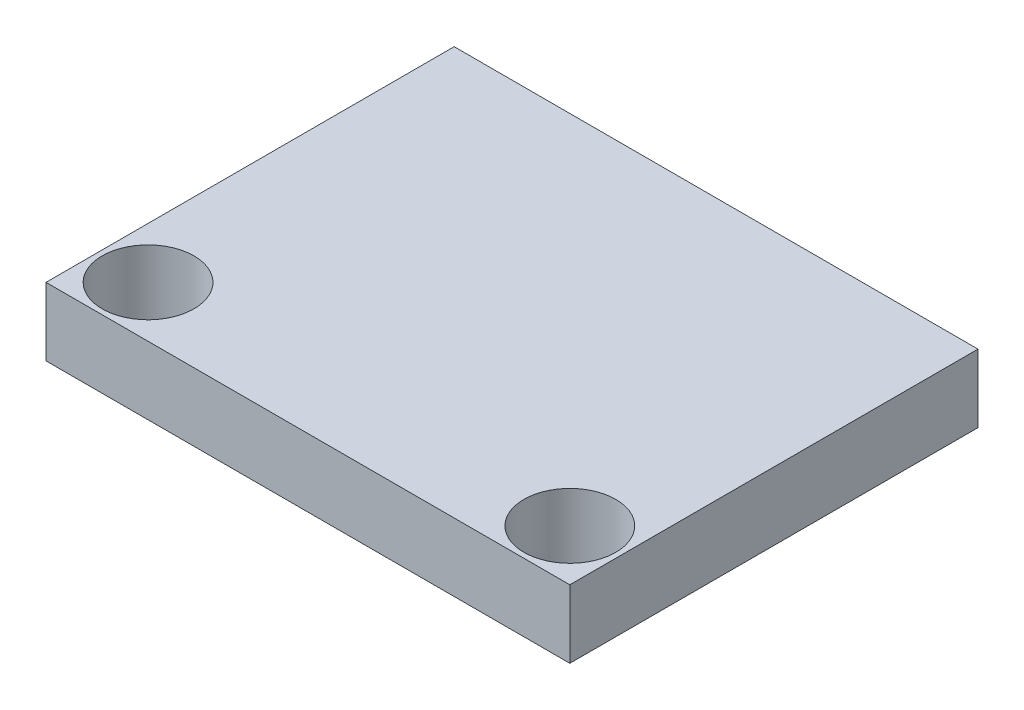
ISO-10303-21;
HEADER;
FILE_DESCRIPTION(('STEP AP214'),'2;1');
FILE_NAME('part.step','',(''),(''),'','','');
FILE_SCHEMA(('AUTOMOTIVE_DESIGN { 1 0 10303 214 1 1 1 1 }'));
ENDSEC;
DATA;
#1=APPLICATION_CONTEXT('core data for automotive mechanical design processes');
#2=APPLICATION_PROTOCOL_DEFINITION('international standard','automotive_design',2000,#1);
#3=PRODUCT_CONTEXT('',#1,'mechanical');
#4=PRODUCT('Part','Part','',(#3));
#5=PRODUCT_RELATED_PRODUCT_CATEGORY('part','',(#4));
#6=PRODUCT_DEFINITION_FORMATION('','',#4);
#7=PRODUCT_DEFINITION_CONTEXT('part definition',#1,'design');
#8=PRODUCT_DEFINITION('design','',#6,#7);
#9=PRODUCT_DEFINITION_SHAPE('','',#8);
#10=(LENGTH_UNIT() NAMED_UNIT(*) SI_UNIT(.MILLI.,.METRE.));
#11=(NAMED_UNIT(*) PLANE_ANGLE_UNIT() SI_UNIT($,.RADIAN.));
#12=(NAMED_UNIT(*) SI_UNIT($,.STERADIAN.) SOLID_ANGLE_UNIT());
#13=UNCERTAINTY_MEASURE_WITH_UNIT(LENGTH_MEASURE(1.E-05),#10,'distance_accuracy_value','');
#14=(GEOMETRIC_REPRESENTATION_CONTEXT(3) GLOBAL_UNCERTAINTY_ASSIGNED_CONTEXT((#13)) GLOBAL_UNIT_ASSIGNED_CONTEXT((#10,
#11,#12)) REPRESENTATION_CONTEXT('',''));
#15=CARTESIAN_POINT('',(0.,0.,0.));
#16=DIRECTION('',(0.,0.,1.));
#17=DIRECTION('',(1.,0.,0.));
#18=AXIS2_PLACEMENT_3D('',#15,#16,#17);
#19=CARTESIAN_POINT('',(-77.,20.,0.));
#20=DIRECTION('',(0.,0.,-1.));
#21=DIRECTION('',(-1.,0.,0.));
#22=AXIS2_PLACEMENT_3D('',#19,#20,#21);
#23=PLANE('',#22);
#24=DIRECTION('',(1.,0.,0.));
#25=VECTOR('',#24,1.);
#26=CARTESIAN_POINT('',(-77.,0.,0.));
#27=LINE('',#26,#25);
#28=CARTESIAN_POINT('',(-77.,0.,0.));
#29=VERTEX_POINT('',#28);
#30=CARTESIAN_POINT('',(77.,0.,0.));
#31=VERTEX_POINT('',#30);
#32=EDGE_CURVE('E100',#29,#31,#27,.T.);
#33=ORIENTED_EDGE('',*,*,#32,.T.);
#34=DIRECTION('',(0.,-1.,0.));
#35=VECTOR('',#34,1.);
#36=CARTESIAN_POINT('',(77.,20.,0.));
#37=LINE('',#36,#35);
#38=CARTESIAN_POINT('',(77.,20.,0.));
#39=VERTEX_POINT('',#38);
#40=EDGE_CURVE('E11',#39,#31,#37,.T.);
#41=ORIENTED_EDGE('',*,*,#40,.F.);
#42=DIRECTION('',(1.,0.,0.));
#43=VECTOR('',#42,1.);
#44=CARTESIAN_POINT('',(-77.,20.,0.));
#45=LINE('',#44,#43);
#46=CARTESIAN_POINT('',(-77.,20.,0.));
#47=VERTEX_POINT('',#46);
#48=EDGE_CURVE('E88',#47,#39,#45,.T.);
#49=ORIENTED_EDGE('',*,*,#48,.F.);
#50=DIRECTION('',(0.,-1.,0.));
#51=VECTOR('',#50,1.);
#52=CARTESIAN_POINT('',(-77.,20.,0.));
#53=LINE('',#52,#51);
#54=EDGE_CURVE('E96',#47,#29,#53,.T.);
#55=ORIENTED_EDGE('',*,*,#54,.T.);
#56=EDGE_LOOP('',(#33,#41,#49,#55));
#57=FACE_BOUND('',#56,.T.);
#58=ADVANCED_FACE('F37',(#57),#23,.F.);
#59=CARTESIAN_POINT('',(77.,20.,0.));
#60=DIRECTION('',(-1.,0.,0.));
#61=DIRECTION('',(0.,0.,1.));
#62=AXIS2_PLACEMENT_3D('',#59,#60,#61);
#63=PLANE('',#62);
#64=DIRECTION('',(0.,0.,-1.));
#65=VECTOR('',#64,1.);
#66=CARTESIAN_POINT('',(77.,0.,0.));
#67=LINE('',#66,#65);
#68=CARTESIAN_POINT('',(77.,0.,-120.));
#69=VERTEX_POINT('',#68);
#70=EDGE_CURVE('E92',#31,#69,#67,.T.);
#71=ORIENTED_EDGE('',*,*,#70,.T.);
#72=DIRECTION('',(0.,-1.,0.));
#73=VECTOR('',#72,1.);
#74=CARTESIAN_POINT('',(77.,20.,-120.));
#75=LINE('',#74,#73);
#76=CARTESIAN_POINT('',(77.,20.,-120.));
#77=VERTEX_POINT('',#76);
#78=EDGE_CURVE('E45',#77,#69,#75,.T.);
#79=ORIENTED_EDGE('',*,*,#78,.F.);
#80=DIRECTION('',(0.,0.,-1.));
#81=VECTOR('',#80,1.);
#82=CARTESIAN_POINT('',(77.,20.,0.));
#83=LINE('',#82,#81);
#84=EDGE_CURVE('E83',#39,#77,#83,.T.);
#85=ORIENTED_EDGE('',*,*,#84,.F.);
#86=ORIENTED_EDGE('',*,*,#40,.T.);
#87=EDGE_LOOP('',(#71,#79,#85,#86));
#88=FACE_BOUND('',#87,.T.);
#89=ADVANCED_FACE('F91',(#88),#63,.F.);
#90=CARTESIAN_POINT('',(77.,20.,-120.));
#91=DIRECTION('',(0.,0.,1.));
#92=DIRECTION('',(1.,0.,0.));
#93=AXIS2_PLACEMENT_3D('',#90,#91,#92);
#94=PLANE('',#93);
#95=DIRECTION('',(-1.,0.,0.));
#96=VECTOR('',#95,1.);
#97=CARTESIAN_POINT('',(77.,0.,-120.));
#98=LINE('',#97,#96);
#99=CARTESIAN_POINT('',(-77.,0.,-120.));
#100=VERTEX_POINT('',#99);
#101=EDGE_CURVE('E70',#69,#100,#98,.T.);
#102=ORIENTED_EDGE('',*,*,#101,.T.);
#103=DIRECTION('',(0.,-1.,0.));
#104=VECTOR('',#103,1.);
#105=CARTESIAN_POINT('',(-77.,20.,-120.));
#106=LINE('',#105,#104);
#107=CARTESIAN_POINT('',(-77.,20.,-120.));
#108=VERTEX_POINT('',#107);
#109=EDGE_CURVE('E93',#108,#100,#106,.T.);
#110=ORIENTED_EDGE('',*,*,#109,.F.);
#111=DIRECTION('',(-1.,0.,0.));
#112=VECTOR('',#111,1.);
#113=CARTESIAN_POINT('',(77.,20.,-120.));
#114=LINE('',#113,#112);
#115=EDGE_CURVE('E86',#77,#108,#114,.T.);
#116=ORIENTED_EDGE('',*,*,#115,.F.);
#117=ORIENTED_EDGE('',*,*,#78,.T.);
#118=EDGE_LOOP('',(#102,#110,#116,#117));
#119=FACE_BOUND('',#118,.T.);
#120=ADVANCED_FACE('F94',(#119),#94,.F.);
#121=CARTESIAN_POINT('',(-77.,20.,-120.));
#122=DIRECTION('',(1.,0.,0.));
#123=DIRECTION('',(0.,0.,-1.));
#124=AXIS2_PLACEMENT_3D('',#121,#122,#123);
#125=PLANE('',#124);
#126=DIRECTION('',(0.,0.,1.));
#127=VECTOR('',#126,1.);
#128=CARTESIAN_POINT('',(-77.,0.,-120.));
#129=LINE('',#128,#127);
#130=EDGE_CURVE('E76',#100,#29,#129,.T.);
#131=ORIENTED_EDGE('',*,*,#130,.T.);
#132=ORIENTED_EDGE('',*,*,#54,.F.);
#133=DIRECTION('',(0.,0.,1.));
#134=VECTOR('',#133,1.);
#135=CARTESIAN_POINT('',(-77.,20.,-120.));
#136=LINE('',#135,#134);
#137=EDGE_CURVE('E53',#108,#47,#136,.T.);
#138=ORIENTED_EDGE('',*,*,#137,.F.);
#139=ORIENTED_EDGE('',*,*,#109,.T.);
#140=EDGE_LOOP('',(#131,#132,#138,#139));
#141=FACE_BOUND('',#140,.T.);
#142=ADVANCED_FACE('F108',(#141),#125,.F.);
#143=CARTESIAN_POINT('',(0.,20.,0.));
#144=DIRECTION('',(0.,1.,0.));
#145=DIRECTION('',(0.,0.,1.));
#146=AXIS2_PLACEMENT_3D('',#143,#144,#145);
#147=PLANE('',#146);
#148=CARTESIAN_POINT('',(-62.,20.,-15.));
#149=DIRECTION('',(0.,1.,0.));
#150=DIRECTION('',(0.,0.,-1.));
#151=AXIS2_PLACEMENT_3D('',#148,#149,#150);
#152=CIRCLE('',#151,13.5);
#153=CARTESIAN_POINT('',(-62.,20.,-28.5));
#154=VERTEX_POINT('',#153);
#155=EDGE_CURVE('E117',#154,#154,#152,.T.);
#156=ORIENTED_EDGE('',*,*,#155,.F.);
#157=EDGE_LOOP('',(#156));
#158=FACE_BOUND('',#157,.T.);
#159=CARTESIAN_POINT('',(62.,20.,-15.));
#160=DIRECTION('',(0.,-1.,0.));
#161=DIRECTION('',(0.,0.,-1.));
#162=AXIS2_PLACEMENT_3D('',#159,#160,#161);
#163=CIRCLE('',#162,13.5);
#164=CARTESIAN_POINT('',(62.,20.,-28.5));
#165=VERTEX_POINT('',#164);
#166=EDGE_CURVE('E103',#165,#165,#163,.T.);
#167=ORIENTED_EDGE('',*,*,#166,.T.);
#168=EDGE_LOOP('',(#167));
#169=FACE_BOUND('',#168,.T.);
#170=ORIENTED_EDGE('',*,*,#48,.T.);
#171=ORIENTED_EDGE('',*,*,#84,.T.);
#172=ORIENTED_EDGE('',*,*,#115,.T.);
#173=ORIENTED_EDGE('',*,*,#137,.T.);
#174=EDGE_LOOP('',(#170,#171,#172,#173));
#175=FACE_BOUND('',#174,.T.);
#176=ADVANCED_FACE('F84',(#158,#169,#175),#147,.T.);
#177=CARTESIAN_POINT('',(0.,0.,0.));
#178=DIRECTION('',(0.,1.,0.));
#179=DIRECTION('',(0.,0.,1.));
#180=AXIS2_PLACEMENT_3D('',#177,#178,#179);
#181=PLANE('',#180);
#182=CARTESIAN_POINT('',(-62.,0.,-15.));
#183=DIRECTION('',(0.,1.,0.));
#184=DIRECTION('',(0.,0.,-1.));
#185=AXIS2_PLACEMENT_3D('',#182,#183,#184);
#186=CIRCLE('',#185,13.5);
#187=CARTESIAN_POINT('',(-62.,0.,-28.5));
#188=VERTEX_POINT('',#187);
#189=EDGE_CURVE('E120',#188,#188,#186,.T.);
#190=ORIENTED_EDGE('',*,*,#189,.T.);
#191=EDGE_LOOP('',(#190));
#192=FACE_BOUND('',#191,.T.);
#193=CARTESIAN_POINT('',(62.,0.,-15.));
#194=DIRECTION('',(0.,-1.,0.));
#195=DIRECTION('',(0.,0.,-1.));
#196=AXIS2_PLACEMENT_3D('',#193,#194,#195);
#197=CIRCLE('',#196,13.5);
#198=CARTESIAN_POINT('',(62.,0.,-28.5));
#199=VERTEX_POINT('',#198);
#200=EDGE_CURVE('E114',#199,#199,#197,.T.);
#201=ORIENTED_EDGE('',*,*,#200,.F.);
#202=EDGE_LOOP('',(#201));
#203=FACE_BOUND('',#202,.T.);
#204=ORIENTED_EDGE('',*,*,#32,.F.);
#205=ORIENTED_EDGE('',*,*,#130,.F.);
#206=ORIENTED_EDGE('',*,*,#101,.F.);
#207=ORIENTED_EDGE('',*,*,#70,.F.);
#208=EDGE_LOOP('',(#204,#205,#206,#207));
#209=FACE_BOUND('',#208,.T.);
#210=ADVANCED_FACE('F111',(#192,#203,#209),#181,.F.);
#211=CARTESIAN_POINT('',(62.,20.,-15.));
#212=DIRECTION('',(0.,-1.,0.));
#213=DIRECTION('',(0.,0.,-1.));
#214=AXIS2_PLACEMENT_3D('',#211,#212,#213);
#215=CYLINDRICAL_SURFACE('',#214,13.5);
#216=ORIENTED_EDGE('',*,*,#166,.F.);
#217=EDGE_LOOP('',(#216));
#218=FACE_BOUND('',#217,.T.);
#219=ORIENTED_EDGE('',*,*,#200,.T.);
#220=EDGE_LOOP('',(#219));
#221=FACE_BOUND('',#220,.T.);
#222=ADVANCED_FACE('F134',(#218,#221),#215,.F.);
#223=CARTESIAN_POINT('',(-62.,20.,-15.));
#224=DIRECTION('',(0.,-1.,0.));
#225=DIRECTION('',(0.,0.,-1.));
#226=AXIS2_PLACEMENT_3D('',#223,#224,#225);
#227=CYLINDRICAL_SURFACE('',#226,13.5);
#228=ORIENTED_EDGE('',*,*,#155,.T.);
#229=EDGE_LOOP('',(#228));
#230=FACE_BOUND('',#229,.T.);
#231=ORIENTED_EDGE('',*,*,#189,.F.);
#232=EDGE_LOOP('',(#231));
#233=FACE_BOUND('',#232,.T.);
#234=ADVANCED_FACE('F126',(#230,#233),#227,.F.);
#235=CLOSED_SHELL('',(#58,#89,#120,#142,#176,#210,#222,#234));
#236=MANIFOLD_SOLID_BREP('B2',#235);
#237=ADVANCED_BREP_SHAPE_REPRESENTATION('',(#18,#236),#14);
#238=SHAPE_DEFINITION_REPRESENTATION(#9,#237);
ENDSEC;
END-ISO-10303-21;
